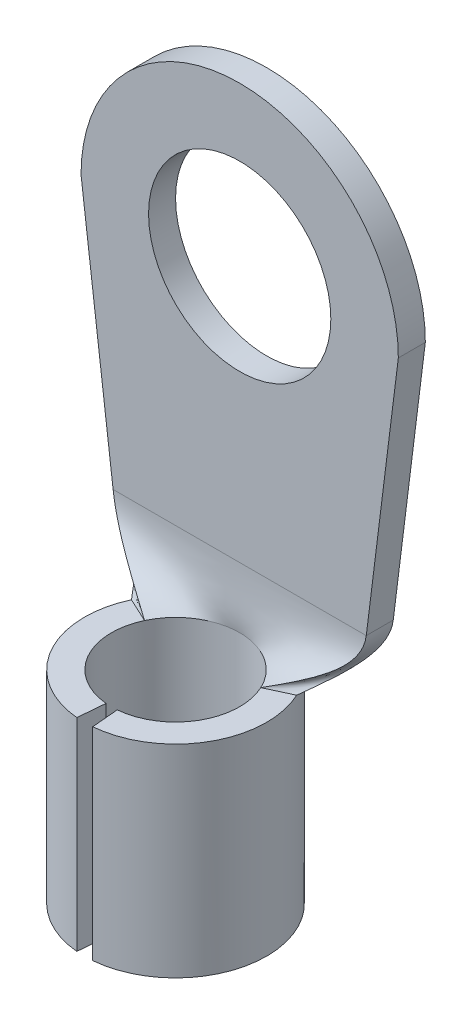
ISO-10303-21;
HEADER;
FILE_DESCRIPTION(('STEP AP214'),'2;1');
FILE_NAME('part.step','',(''),(''),'','','');
FILE_SCHEMA(('AUTOMOTIVE_DESIGN { 1 0 10303 214 1 1 1 1 }'));
ENDSEC;
DATA;
#1=APPLICATION_CONTEXT('core data for automotive mechanical design processes');
#2=APPLICATION_PROTOCOL_DEFINITION('international standard','automotive_design',2000,#1);
#3=PRODUCT_CONTEXT('',#1,'mechanical');
#4=PRODUCT('Part','Part','',(#3));
#5=PRODUCT_RELATED_PRODUCT_CATEGORY('part','',(#4));
#6=PRODUCT_DEFINITION_FORMATION('','',#4);
#7=PRODUCT_DEFINITION_CONTEXT('part definition',#1,'design');
#8=PRODUCT_DEFINITION('design','',#6,#7);
#9=PRODUCT_DEFINITION_SHAPE('','',#8);
#10=(LENGTH_UNIT() NAMED_UNIT(*) SI_UNIT(.MILLI.,.METRE.));
#11=(NAMED_UNIT(*) PLANE_ANGLE_UNIT() SI_UNIT($,.RADIAN.));
#12=(NAMED_UNIT(*) SI_UNIT($,.STERADIAN.) SOLID_ANGLE_UNIT());
#13=UNCERTAINTY_MEASURE_WITH_UNIT(LENGTH_MEASURE(1.E-05),#10,'distance_accuracy_value','');
#14=(GEOMETRIC_REPRESENTATION_CONTEXT(3) GLOBAL_UNCERTAINTY_ASSIGNED_CONTEXT((#13)) GLOBAL_UNIT_ASSIGNED_CONTEXT((#10,
#11,#12)) REPRESENTATION_CONTEXT('',''));
#15=CARTESIAN_POINT('',(0.,0.,0.));
#16=DIRECTION('',(0.,0.,1.));
#17=DIRECTION('',(1.,0.,0.));
#18=AXIS2_PLACEMENT_3D('',#15,#16,#17);
#19=CARTESIAN_POINT('',(5.87716923076923,-0.734646153846153,1.016));
#20=DIRECTION('',(-0.992277876713668,0.124034734589208,0.));
#21=DIRECTION('',(-0.124034734589208,-0.992277876713668,0.));
#22=AXIS2_PLACEMENT_3D('',#19,#20,#21);
#23=PLANE('',#22);
#24=DIRECTION('',(0.124034734589208,0.992277876713668,0.));
#25=VECTOR('',#24,1.);
#26=CARTESIAN_POINT('',(5.87716923076923,-0.734646153846153,0.));
#27=LINE('',#26,#25);
#28=CARTESIAN_POINT('',(4.7625,-9.652,0.));
#29=VERTEX_POINT('',#28);
#30=CARTESIAN_POINT('',(5.969,0.,0.));
#31=VERTEX_POINT('',#30);
#32=EDGE_CURVE('E262',#29,#31,#27,.T.);
#33=ORIENTED_EDGE('',*,*,#32,.T.);
#34=DIRECTION('',(0.,0.,-1.));
#35=VECTOR('',#34,1.);
#36=CARTESIAN_POINT('',(5.969,0.,1.016));
#37=LINE('',#36,#35);
#38=CARTESIAN_POINT('',(5.969,0.,1.016));
#39=VERTEX_POINT('',#38);
#40=EDGE_CURVE('E207',#39,#31,#37,.T.);
#41=ORIENTED_EDGE('',*,*,#40,.F.);
#42=DIRECTION('',(0.124034734589208,0.992277876713668,0.));
#43=VECTOR('',#42,1.);
#44=CARTESIAN_POINT('',(5.87716923076923,-0.734646153846153,1.016));
#45=LINE('',#44,#43);
#46=CARTESIAN_POINT('',(4.7625,-9.652,1.016));
#47=VERTEX_POINT('',#46);
#48=EDGE_CURVE('E295',#47,#39,#45,.T.);
#49=ORIENTED_EDGE('',*,*,#48,.F.);
#50=DIRECTION('',(0.,0.,-1.));
#51=VECTOR('',#50,1.);
#52=CARTESIAN_POINT('',(4.7625,-9.652,1.016));
#53=LINE('',#52,#51);
#54=EDGE_CURVE('E276',#47,#29,#53,.T.);
#55=ORIENTED_EDGE('',*,*,#54,.T.);
#56=EDGE_LOOP('',(#33,#41,#49,#55));
#57=FACE_BOUND('',#56,.T.);
#58=ADVANCED_FACE('F56',(#57),#23,.F.);
#59=CARTESIAN_POINT('',(0.,0.,1.016));
#60=DIRECTION('',(0.,0.,-1.));
#61=DIRECTION('',(-1.,0.,0.));
#62=AXIS2_PLACEMENT_3D('',#59,#60,#61);
#63=CYLINDRICAL_SURFACE('',#62,5.969);
#64=CARTESIAN_POINT('',(0.,0.,0.));
#65=DIRECTION('',(0.,0.,1.));
#66=DIRECTION('',(1.,0.,0.));
#67=AXIS2_PLACEMENT_3D('',#64,#65,#66);
#68=CIRCLE('',#67,5.969);
#69=CARTESIAN_POINT('',(-5.969,0.,0.));
#70=VERTEX_POINT('',#69);
#71=EDGE_CURVE('E285',#31,#70,#68,.T.);
#72=ORIENTED_EDGE('',*,*,#71,.T.);
#73=DIRECTION('',(0.,0.,-1.));
#74=VECTOR('',#73,1.);
#75=CARTESIAN_POINT('',(-5.969,0.,1.016));
#76=LINE('',#75,#74);
#77=CARTESIAN_POINT('',(-5.969,0.,1.016));
#78=VERTEX_POINT('',#77);
#79=EDGE_CURVE('E211',#78,#70,#76,.T.);
#80=ORIENTED_EDGE('',*,*,#79,.F.);
#81=CARTESIAN_POINT('',(0.,0.,1.016));
#82=DIRECTION('',(0.,0.,1.));
#83=DIRECTION('',(1.,0.,0.));
#84=AXIS2_PLACEMENT_3D('',#81,#82,#83);
#85=CIRCLE('',#84,5.969);
#86=EDGE_CURVE('E294',#39,#78,#85,.T.);
#87=ORIENTED_EDGE('',*,*,#86,.F.);
#88=ORIENTED_EDGE('',*,*,#40,.T.);
#89=EDGE_LOOP('',(#72,#80,#87,#88));
#90=FACE_BOUND('',#89,.T.);
#91=ADVANCED_FACE('F320',(#90),#63,.T.);
#92=CARTESIAN_POINT('',(-5.87716923076923,-0.734646153846154,1.016));
#93=DIRECTION('',(-0.992277876713668,-0.124034734589208,0.));
#94=DIRECTION('',(0.124034734589208,-0.992277876713668,0.));
#95=AXIS2_PLACEMENT_3D('',#92,#93,#94);
#96=PLANE('',#95);
#97=DIRECTION('',(-0.124034734589208,0.992277876713668,0.));
#98=VECTOR('',#97,1.);
#99=CARTESIAN_POINT('',(-5.87716923076923,-0.734646153846154,0.));
#100=LINE('',#99,#98);
#101=CARTESIAN_POINT('',(-4.7625,-9.652,0.));
#102=VERTEX_POINT('',#101);
#103=EDGE_CURVE('E282',#102,#70,#100,.T.);
#104=ORIENTED_EDGE('',*,*,#103,.F.);
#105=DIRECTION('',(0.,0.,-1.));
#106=VECTOR('',#105,1.);
#107=CARTESIAN_POINT('',(-4.7625,-9.652,1.016));
#108=LINE('',#107,#106);
#109=CARTESIAN_POINT('',(-4.7625,-9.652,1.016));
#110=VERTEX_POINT('',#109);
#111=EDGE_CURVE('E273',#110,#102,#108,.T.);
#112=ORIENTED_EDGE('',*,*,#111,.F.);
#113=DIRECTION('',(-0.124034734589208,0.992277876713668,0.));
#114=VECTOR('',#113,1.);
#115=CARTESIAN_POINT('',(-5.87716923076923,-0.734646153846154,1.016));
#116=LINE('',#115,#114);
#117=EDGE_CURVE('E291',#110,#78,#116,.T.);
#118=ORIENTED_EDGE('',*,*,#117,.T.);
#119=ORIENTED_EDGE('',*,*,#79,.T.);
#120=EDGE_LOOP('',(#104,#112,#118,#119));
#121=FACE_BOUND('',#120,.T.);
#122=ADVANCED_FACE('F317',(#121),#96,.T.);
#123=CARTESIAN_POINT('',(0.,0.,1.016));
#124=DIRECTION('',(0.,0.,-1.));
#125=DIRECTION('',(-1.,0.,0.));
#126=AXIS2_PLACEMENT_3D('',#123,#124,#125);
#127=CYLINDRICAL_SURFACE('',#126,3.429);
#128=CARTESIAN_POINT('',(0.,0.,1.016));
#129=DIRECTION('',(0.,0.,1.));
#130=DIRECTION('',(1.,0.,0.));
#131=AXIS2_PLACEMENT_3D('',#128,#129,#130);
#132=CIRCLE('',#131,3.429);
#133=CARTESIAN_POINT('',(3.429,0.,1.016));
#134=VERTEX_POINT('',#133);
#135=EDGE_CURVE('E245',#134,#134,#132,.T.);
#136=ORIENTED_EDGE('',*,*,#135,.T.);
#137=EDGE_LOOP('',(#136));
#138=FACE_BOUND('',#137,.T.);
#139=CARTESIAN_POINT('',(0.,0.,0.));
#140=DIRECTION('',(0.,0.,1.));
#141=DIRECTION('',(1.,0.,0.));
#142=AXIS2_PLACEMENT_3D('',#139,#140,#141);
#143=CIRCLE('',#142,3.429);
#144=CARTESIAN_POINT('',(3.429,0.,0.));
#145=VERTEX_POINT('',#144);
#146=EDGE_CURVE('E258',#145,#145,#143,.T.);
#147=ORIENTED_EDGE('',*,*,#146,.F.);
#148=EDGE_LOOP('',(#147));
#149=FACE_BOUND('',#148,.T.);
#150=ADVANCED_FACE('F303',(#138,#149),#127,.F.);
#151=CARTESIAN_POINT('',(0.,0.,1.016));
#152=DIRECTION('',(0.,0.,1.));
#153=DIRECTION('',(1.,0.,0.));
#154=AXIS2_PLACEMENT_3D('',#151,#152,#153);
#155=PLANE('',#154);
#156=ORIENTED_EDGE('',*,*,#135,.F.);
#157=EDGE_LOOP('',(#156));
#158=FACE_BOUND('',#157,.T.);
#159=ORIENTED_EDGE('',*,*,#48,.T.);
#160=ORIENTED_EDGE('',*,*,#86,.T.);
#161=ORIENTED_EDGE('',*,*,#117,.F.);
#162=DIRECTION('',(1.,0.,0.));
#163=VECTOR('',#162,1.);
#164=CARTESIAN_POINT('',(0.,-9.652,1.016));
#165=LINE('',#164,#163);
#166=EDGE_CURVE('E278',#110,#47,#165,.T.);
#167=ORIENTED_EDGE('',*,*,#166,.T.);
#168=EDGE_LOOP('',(#159,#160,#161,#167));
#169=FACE_BOUND('',#168,.T.);
#170=ADVANCED_FACE('F306',(#158,#169),#155,.T.);
#171=CARTESIAN_POINT('',(0.,0.,0.));
#172=DIRECTION('',(0.,0.,1.));
#173=DIRECTION('',(1.,0.,0.));
#174=AXIS2_PLACEMENT_3D('',#171,#172,#173);
#175=PLANE('',#174);
#176=ORIENTED_EDGE('',*,*,#146,.T.);
#177=EDGE_LOOP('',(#176));
#178=FACE_BOUND('',#177,.T.);
#179=ORIENTED_EDGE('',*,*,#32,.F.);
#180=DIRECTION('',(1.,0.,0.));
#181=VECTOR('',#180,1.);
#182=CARTESIAN_POINT('',(0.,-9.652,0.));
#183=LINE('',#182,#181);
#184=EDGE_CURVE('E279',#102,#29,#183,.T.);
#185=ORIENTED_EDGE('',*,*,#184,.F.);
#186=ORIENTED_EDGE('',*,*,#103,.T.);
#187=ORIENTED_EDGE('',*,*,#71,.F.);
#188=EDGE_LOOP('',(#179,#185,#186,#187));
#189=FACE_BOUND('',#188,.T.);
#190=ADVANCED_FACE('F308',(#178,#189),#175,.F.);
#191=CARTESIAN_POINT('',(4.7625,-9.652,0.));
#192=CARTESIAN_POINT('',(4.61997193408457,-10.7922245273234,0.));
#193=CARTESIAN_POINT('',(3.86385066791662,-11.3651122636617,0.989920990245575));
#194=CARTESIAN_POINT('',(3.10772940174868,-11.938,1.97984198049115));
#195=CARTESIAN_POINT('',(4.7625,-9.652,1.016));
#196=CARTESIAN_POINT('',(4.60890783998083,-10.8807372801533,1.016));
#197=CARTESIAN_POINT('',(3.39791426505014,-11.4093686400767,1.71261106720985));
#198=CARTESIAN_POINT('',(2.18692069011944,-11.938,2.4092221344197));
#199=B_SPLINE_SURFACE_WITH_KNOTS('',1,3,((#191,#192,#193,#194),(#195,#196,#197,#198)),
.UNSPECIFIED.,.F.,.F.,.F.,(2,2),(4,4),(0.,1.),(0.,1.),.UNSPECIFIED.);
#200=CARTESIAN_POINT('',(4.7625,-9.652,1.016));
#201=CARTESIAN_POINT('',(4.60890783998083,-10.8807372801533,1.016));
#202=CARTESIAN_POINT('',(3.39791426505014,-11.4093686400767,1.71261106720985));
#203=CARTESIAN_POINT('',(2.18692069011944,-11.938,2.4092221344197));
#204=B_SPLINE_CURVE_WITH_KNOTS('',3,(#200,#201,#202,#203),.UNSPECIFIED.,.F.,.F.,(4,4),(0.,1.),.UNSPECIFIED.);
#205=CARTESIAN_POINT('',(2.18692069011944,-11.938,2.4092221344197));
#206=VERTEX_POINT('',#205);
#207=EDGE_CURVE('E255',#47,#206,#204,.T.);
#208=DIRECTION('',(-0.906307787036651,0.,0.422618261740697));
#209=VECTOR('',#208,1.);
#210=CARTESIAN_POINT('',(2.18692069011944,-11.938,2.4092221344197));
#211=LINE('',#210,#209);
#212=CARTESIAN_POINT('',(3.10772940174868,-11.938,1.97984198049115));
#213=VERTEX_POINT('',#212);
#214=EDGE_CURVE('E200',#213,#206,#211,.T.);
#215=CARTESIAN_POINT('',(4.7625,-9.652,0.));
#216=CARTESIAN_POINT('',(4.61997193408457,-10.7922245273234,0.));
#217=CARTESIAN_POINT('',(3.86385066791662,-11.3651122636617,0.989920990245575));
#218=CARTESIAN_POINT('',(3.10772940174868,-11.938,1.97984198049115));
#219=B_SPLINE_CURVE_WITH_KNOTS('',3,(#215,#216,#217,#218),.UNSPECIFIED.,.F.,.F.,(4,4),(0.,1.),.UNSPECIFIED.);
#220=EDGE_CURVE('E223',#213,#29,#219,.F.);
#221=ORIENTED_EDGE('',*,*,#54,.F.);
#222=ORIENTED_EDGE('',*,*,#207,.T.);
#223=ORIENTED_EDGE('',*,*,#214,.F.);
#224=ORIENTED_EDGE('',*,*,#220,.T.);
#225=EDGE_LOOP('',(#221,#222,#223,#224));
#226=FACE_BOUND('',#225,.T.);
#227=ADVANCED_FACE('F314',(#226),#199,.T.);
#228=CARTESIAN_POINT('',(4.7625,-9.652,1.016));
#229=CARTESIAN_POINT('',(4.60890783998083,-10.8807372801533,1.016));
#230=CARTESIAN_POINT('',(3.39791426505014,-11.4093686400767,1.71261106720985));
#231=CARTESIAN_POINT('',(2.18692069011944,-11.938,2.4092221344197));
#232=CARTESIAN_POINT('',(1.5875,-9.652,1.016));
#233=CARTESIAN_POINT('',(1.53630261332695,-10.8807372801533,1.016));
#234=CARTESIAN_POINT('',(1.47060725154774,-11.0785469924376,0.874735506767064));
#235=CARTESIAN_POINT('',(1.18517093190492,-11.938,0.26096284530987));
#236=CARTESIAN_POINT('',(-1.5875,-9.652,1.016));
#237=CARTESIAN_POINT('',(-1.53630261332694,-10.8807372801533,1.016));
#238=CARTESIAN_POINT('',(-1.47060725154773,-11.0785469924376,0.874735506767064));
#239=CARTESIAN_POINT('',(-1.18517093190492,-11.938,0.260962845309871));
#240=CARTESIAN_POINT('',(-4.7625,-9.652,1.016));
#241=CARTESIAN_POINT('',(-4.60890783998083,-10.8807372801533,1.016));
#242=CARTESIAN_POINT('',(-3.39791426505013,-11.4093686400767,1.71261106720985));
#243=CARTESIAN_POINT('',(-2.18692069011944,-11.938,2.4092221344197));
#244=(BOUNDED_SURFACE() B_SPLINE_SURFACE(3,3,((#228,#229,#230,#231),(#232,#233,#234,#235),(#236,
#237,#238,#239),(#240,#241,#242,#243)),.UNSPECIFIED.,.F.,.F.,
.F.) B_SPLINE_SURFACE_WITH_KNOTS((4,4),(4,4),(0.,1.),(0.,1.),
.UNSPECIFIED.) GEOMETRIC_REPRESENTATION_ITEM() RATIONAL_B_SPLINE_SURFACE(((1.,1.,1.,1.),(1.,1.,
0.615078841160465,0.615078841160465),(1.,1.,0.615078841160465,0.615078841160465),(1.,1.,1.,1.))) REPRESENTATION_ITEM('') SURFACE());
#245=CARTESIAN_POINT('',(-4.7625,-9.652,1.016));
#246=CARTESIAN_POINT('',(-4.60890783998083,-10.8807372801533,1.016));
#247=CARTESIAN_POINT('',(-3.39791426505013,-11.4093686400767,1.71261106720985));
#248=CARTESIAN_POINT('',(-2.18692069011944,-11.938,2.4092221344197));
#249=B_SPLINE_CURVE_WITH_KNOTS('',3,(#245,#246,#247,#248),.UNSPECIFIED.,.F.,.F.,(4,4),(0.,1.),.UNSPECIFIED.);
#250=CARTESIAN_POINT('',(-2.18692069011944,-11.938,2.4092221344197));
#251=VERTEX_POINT('',#250);
#252=EDGE_CURVE('E218',#110,#251,#249,.T.);
#253=CARTESIAN_POINT('',(0.,-11.938,3.429));
#254=DIRECTION('',(0.,1.,0.));
#255=DIRECTION('',(1.,0.,0.));
#256=AXIS2_PLACEMENT_3D('',#253,#254,#255);
#257=CIRCLE('',#256,2.413);
#258=EDGE_CURVE('E177',#206,#251,#257,.T.);
#259=ORIENTED_EDGE('',*,*,#166,.F.);
#260=ORIENTED_EDGE('',*,*,#252,.T.);
#261=ORIENTED_EDGE('',*,*,#258,.F.);
#262=ORIENTED_EDGE('',*,*,#207,.F.);
#263=EDGE_LOOP('',(#259,#260,#261,#262));
#264=FACE_BOUND('',#263,.T.);
#265=ADVANCED_FACE('F367',(#264),#244,.T.);
#266=CARTESIAN_POINT('',(-4.7625,-9.652,0.));
#267=CARTESIAN_POINT('',(-4.61997193408457,-10.7922245273234,0.));
#268=CARTESIAN_POINT('',(-3.86385066791662,-11.3651122636617,0.989920990245576));
#269=CARTESIAN_POINT('',(-3.10772940174868,-11.938,1.97984198049115));
#270=CARTESIAN_POINT('',(-1.5875,-9.652,0.));
#271=CARTESIAN_POINT('',(-1.53999064469486,-10.7922245273234,0.));
#272=CARTESIAN_POINT('',(-1.56696982989161,-11.0065946288489,-0.20074427985733));
#273=CARTESIAN_POINT('',(-1.68419027165436,-11.938,-1.07294753561229));
#274=CARTESIAN_POINT('',(1.5875,-9.652,0.));
#275=CARTESIAN_POINT('',(1.53999064469486,-10.7922245273234,0.));
#276=CARTESIAN_POINT('',(1.56696982989161,-11.0065946288489,-0.20074427985733));
#277=CARTESIAN_POINT('',(1.68419027165436,-11.938,-1.07294753561229));
#278=CARTESIAN_POINT('',(4.7625,-9.652,0.));
#279=CARTESIAN_POINT('',(4.61997193408457,-10.7922245273234,0.));
#280=CARTESIAN_POINT('',(3.86385066791662,-11.3651122636617,0.989920990245574));
#281=CARTESIAN_POINT('',(3.10772940174868,-11.938,1.97984198049115));
#282=(BOUNDED_SURFACE() B_SPLINE_SURFACE(3,3,((#266,#267,#268,#269),(#270,#271,#272,#273),(#274,
#275,#276,#277),(#278,#279,#280,#281)),.UNSPECIFIED.,.F.,.F.,
.F.) B_SPLINE_SURFACE_WITH_KNOTS((4,4),(4,4),(0.,1.),(0.,1.),
.UNSPECIFIED.) GEOMETRIC_REPRESENTATION_ITEM() RATIONAL_B_SPLINE_SURFACE(((1.,1.,1.,1.),(1.,1.,
0.615078841160465,0.615078841160465),(1.,1.,0.615078841160465,0.615078841160465),(1.,1.,1.,1.))) REPRESENTATION_ITEM('') SURFACE());
#283=CARTESIAN_POINT('',(0.,-11.938,3.429));
#284=DIRECTION('',(0.,-1.,0.));
#285=DIRECTION('',(1.,0.,0.));
#286=AXIS2_PLACEMENT_3D('',#283,#284,#285);
#287=CIRCLE('',#286,3.429);
#288=CARTESIAN_POINT('',(-3.10772940174867,-11.938,1.97984198049115));
#289=VERTEX_POINT('',#288);
#290=EDGE_CURVE('E191',#289,#213,#287,.T.);
#291=CARTESIAN_POINT('',(-4.7625,-9.652,0.));
#292=CARTESIAN_POINT('',(-4.61997193408457,-10.7922245273234,0.));
#293=CARTESIAN_POINT('',(-3.86385066791662,-11.3651122636617,0.989920990245576));
#294=CARTESIAN_POINT('',(-3.10772940174868,-11.938,1.97984198049115));
#295=B_SPLINE_CURVE_WITH_KNOTS('',3,(#291,#292,#293,#294),.UNSPECIFIED.,.F.,.F.,(4,4),(0.,1.),.UNSPECIFIED.);
#296=EDGE_CURVE('E224',#289,#102,#295,.F.);
#297=ORIENTED_EDGE('',*,*,#184,.T.);
#298=ORIENTED_EDGE('',*,*,#220,.F.);
#299=ORIENTED_EDGE('',*,*,#290,.F.);
#300=ORIENTED_EDGE('',*,*,#296,.T.);
#301=EDGE_LOOP('',(#297,#298,#299,#300));
#302=FACE_BOUND('',#301,.T.);
#303=ADVANCED_FACE('F343',(#302),#282,.T.);
#304=CARTESIAN_POINT('',(-4.7625,-9.652,1.016));
#305=CARTESIAN_POINT('',(-4.60890783998083,-10.8807372801533,1.016));
#306=CARTESIAN_POINT('',(-3.39791426505013,-11.4093686400767,1.71261106720985));
#307=CARTESIAN_POINT('',(-2.18692069011944,-11.938,2.4092221344197));
#308=CARTESIAN_POINT('',(-4.7625,-9.652,0.));
#309=CARTESIAN_POINT('',(-4.61997193408457,-10.7922245273234,0.));
#310=CARTESIAN_POINT('',(-3.86385066791662,-11.3651122636617,0.989920990245575));
#311=CARTESIAN_POINT('',(-3.10772940174867,-11.938,1.97984198049115));
#312=B_SPLINE_SURFACE_WITH_KNOTS('',1,3,((#304,#305,#306,#307),(#308,#309,#310,#311)),
.UNSPECIFIED.,.F.,.F.,.F.,(2,2),(4,4),(0.,1.),(0.,1.),.UNSPECIFIED.);
#313=DIRECTION('',(-0.906307787036651,0.,-0.422618261740698));
#314=VECTOR('',#313,1.);
#315=CARTESIAN_POINT('',(-2.18692069011944,-11.938,2.4092221344197));
#316=LINE('',#315,#314);
#317=EDGE_CURVE('E234',#251,#289,#316,.T.);
#318=ORIENTED_EDGE('',*,*,#111,.T.);
#319=ORIENTED_EDGE('',*,*,#296,.F.);
#320=ORIENTED_EDGE('',*,*,#317,.F.);
#321=ORIENTED_EDGE('',*,*,#252,.F.);
#322=EDGE_LOOP('',(#318,#319,#320,#321));
#323=FACE_BOUND('',#322,.T.);
#324=ADVANCED_FACE('F341',(#323),#312,.T.);
#325=CARTESIAN_POINT('',(0.,-11.938,3.429));
#326=DIRECTION('',(0.,-1.,0.));
#327=DIRECTION('',(1.,0.,0.));
#328=AXIS2_PLACEMENT_3D('',#325,#326,#327);
#329=PLANE('',#328);
#330=CARTESIAN_POINT('',(0.,-11.938,3.429));
#331=DIRECTION('',(0.,1.,0.));
#332=DIRECTION('',(1.,0.,0.));
#333=AXIS2_PLACEMENT_3D('',#330,#331,#332);
#334=CIRCLE('',#333,2.413);
#335=CARTESIAN_POINT('',(-0.2103068072501,-11.938,5.83281780649538));
#336=VERTEX_POINT('',#335);
#337=EDGE_CURVE('E171',#251,#336,#334,.T.);
#338=ORIENTED_EDGE('',*,*,#337,.F.);
#339=ORIENTED_EDGE('',*,*,#317,.T.);
#340=CARTESIAN_POINT('',(0.,-11.938,3.429));
#341=DIRECTION('',(0.,-1.,0.));
#342=DIRECTION('',(1.,0.,0.));
#343=AXIS2_PLACEMENT_3D('',#340,#341,#342);
#344=CIRCLE('',#343,3.429);
#345=CARTESIAN_POINT('',(-0.298857041881718,-11.938,6.8449516197566));
#346=VERTEX_POINT('',#345);
#347=EDGE_CURVE('E182',#346,#289,#344,.T.);
#348=ORIENTED_EDGE('',*,*,#347,.F.);
#349=DIRECTION('',(-0.087155742747655,0.,0.996194698091746));
#350=VECTOR('',#349,1.);
#351=CARTESIAN_POINT('',(-0.2103068072501,-11.938,5.83281780649538));
#352=LINE('',#351,#350);
#353=EDGE_CURVE('E151',#336,#346,#352,.T.);
#354=ORIENTED_EDGE('',*,*,#353,.F.);
#355=EDGE_LOOP('',(#338,#339,#348,#354));
#356=FACE_BOUND('',#355,.T.);
#357=ADVANCED_FACE('F346',(#356),#329,.F.);
#358=CARTESIAN_POINT('',(0.298857041881722,-11.938,6.8449516197566));
#359=VERTEX_POINT('',#358);
#360=EDGE_CURVE('E186',#213,#359,#344,.T.);
#361=ORIENTED_EDGE('',*,*,#360,.F.);
#362=ORIENTED_EDGE('',*,*,#214,.T.);
#363=CARTESIAN_POINT('',(0.210306807250101,-11.938,5.83281780649538));
#364=VERTEX_POINT('',#363);
#365=EDGE_CURVE('E174',#364,#206,#334,.T.);
#366=ORIENTED_EDGE('',*,*,#365,.F.);
#367=DIRECTION('',(-0.0871557427476584,0.,-0.996194698091746));
#368=VECTOR('',#367,1.);
#369=CARTESIAN_POINT('',(0.210306807250101,-11.938,5.83281780649538));
#370=LINE('',#369,#368);
#371=EDGE_CURVE('E145',#359,#364,#370,.T.);
#372=ORIENTED_EDGE('',*,*,#371,.F.);
#373=EDGE_LOOP('',(#361,#362,#366,#372));
#374=FACE_BOUND('',#373,.T.);
#375=ADVANCED_FACE('F198',(#374),#329,.F.);
#376=CARTESIAN_POINT('',(0.,-19.558,3.429));
#377=DIRECTION('',(0.,1.,0.));
#378=DIRECTION('',(-1.,0.,0.));
#379=AXIS2_PLACEMENT_3D('',#376,#377,#378);
#380=CYLINDRICAL_SURFACE('',#379,2.413);
#381=DIRECTION('',(0.,1.,0.));
#382=VECTOR('',#381,1.);
#383=CARTESIAN_POINT('',(-0.210306807250098,-19.558,5.83281780649538));
#384=LINE('',#383,#382);
#385=CARTESIAN_POINT('',(-0.210306807250098,-19.304,5.83281780649538));
#386=VERTEX_POINT('',#385);
#387=EDGE_CURVE('E155',#386,#336,#384,.T.);
#388=ORIENTED_EDGE('',*,*,#387,.F.);
#389=CARTESIAN_POINT('',(0.,-19.304,3.429));
#390=DIRECTION('',(0.,-1.,0.));
#391=DIRECTION('',(1.,0.,0.));
#392=AXIS2_PLACEMENT_3D('',#389,#390,#391);
#393=CIRCLE('',#392,2.413);
#394=CARTESIAN_POINT('',(0.210306807250102,-19.304,5.83281780649538));
#395=VERTEX_POINT('',#394);
#396=EDGE_CURVE('E64',#386,#395,#393,.T.);
#397=ORIENTED_EDGE('',*,*,#396,.T.);
#398=DIRECTION('',(0.,1.,0.));
#399=VECTOR('',#398,1.);
#400=CARTESIAN_POINT('',(0.210306807250102,-19.558,5.83281780649538));
#401=LINE('',#400,#399);
#402=EDGE_CURVE('E163',#395,#364,#401,.T.);
#403=ORIENTED_EDGE('',*,*,#402,.T.);
#404=ORIENTED_EDGE('',*,*,#365,.T.);
#405=ORIENTED_EDGE('',*,*,#258,.T.);
#406=ORIENTED_EDGE('',*,*,#337,.T.);
#407=EDGE_LOOP('',(#388,#397,#403,#404,#405,#406));
#408=FACE_BOUND('',#407,.T.);
#409=ADVANCED_FACE('F202',(#408),#380,.F.);
#410=CARTESIAN_POINT('',(-0.210306807250098,-19.558,5.83281780649538));
#411=DIRECTION('',(-0.996194698091746,0.,-0.087155742747655));
#412=DIRECTION('',(-0.0871557427476551,0.,0.996194698091746));
#413=AXIS2_PLACEMENT_3D('',#410,#411,#412);
#414=PLANE('',#413);
#415=DIRECTION('',(-0.087155742747655,0.,0.996194698091746));
#416=VECTOR('',#415,1.);
#417=CARTESIAN_POINT('',(-0.210306807250098,-19.558,5.83281780649538));
#418=LINE('',#417,#416);
#419=CARTESIAN_POINT('',(-0.232444365908003,-19.558,6.08585125981069));
#420=VERTEX_POINT('',#419);
#421=CARTESIAN_POINT('',(-0.298857041881716,-19.558,6.8449516197566));
#422=VERTEX_POINT('',#421);
#423=EDGE_CURVE('E136',#420,#422,#418,.T.);
#424=ORIENTED_EDGE('',*,*,#423,.F.);
#425=CARTESIAN_POINT('',(-0.232444365907992,-19.304,6.08585125981069));
#426=DIRECTION('',(-0.996194698091746,0.,-0.087155742747655));
#427=DIRECTION('',(-0.0871557427476551,0.,0.996194698091746));
#428=AXIS2_PLACEMENT_3D('',#425,#426,#427);
#429=CIRCLE('',#428,0.254);
#430=EDGE_CURVE('E78',#420,#386,#429,.F.);
#431=ORIENTED_EDGE('',*,*,#430,.T.);
#432=ORIENTED_EDGE('',*,*,#387,.T.);
#433=ORIENTED_EDGE('',*,*,#353,.T.);
#434=DIRECTION('',(0.,1.,0.));
#435=VECTOR('',#434,1.);
#436=CARTESIAN_POINT('',(-0.298857041881716,-19.558,6.8449516197566));
#437=LINE('',#436,#435);
#438=EDGE_CURVE('E148',#422,#346,#437,.T.);
#439=ORIENTED_EDGE('',*,*,#438,.F.);
#440=EDGE_LOOP('',(#424,#431,#432,#433,#439));
#441=FACE_BOUND('',#440,.T.);
#442=ADVANCED_FACE('F149',(#441),#414,.F.);
#443=CARTESIAN_POINT('',(0.,-19.558,3.429));
#444=DIRECTION('',(0.,1.,0.));
#445=DIRECTION('',(-1.,0.,0.));
#446=AXIS2_PLACEMENT_3D('',#443,#444,#445);
#447=CYLINDRICAL_SURFACE('',#446,3.429);
#448=ORIENTED_EDGE('',*,*,#347,.T.);
#449=ORIENTED_EDGE('',*,*,#290,.T.);
#450=ORIENTED_EDGE('',*,*,#360,.T.);
#451=DIRECTION('',(0.,1.,0.));
#452=VECTOR('',#451,1.);
#453=CARTESIAN_POINT('',(0.298857041881723,-19.558,6.8449516197566));
#454=LINE('',#453,#452);
#455=CARTESIAN_POINT('',(0.298857041881723,-19.558,6.8449516197566));
#456=VERTEX_POINT('',#455);
#457=EDGE_CURVE('E156',#456,#359,#454,.T.);
#458=ORIENTED_EDGE('',*,*,#457,.F.);
#459=CARTESIAN_POINT('',(0.,-19.558,3.429));
#460=DIRECTION('',(0.,-1.,0.));
#461=DIRECTION('',(1.,0.,0.));
#462=AXIS2_PLACEMENT_3D('',#459,#460,#461);
#463=CIRCLE('',#462,3.429);
#464=EDGE_CURVE('E141',#422,#456,#463,.T.);
#465=ORIENTED_EDGE('',*,*,#464,.F.);
#466=ORIENTED_EDGE('',*,*,#438,.T.);
#467=EDGE_LOOP('',(#448,#449,#450,#458,#465,#466));
#468=FACE_BOUND('',#467,.T.);
#469=ADVANCED_FACE('F158',(#468),#447,.T.);
#470=CARTESIAN_POINT('',(0.210306807250102,-19.558,5.83281780649538));
#471=DIRECTION('',(0.996194698091745,0.,-0.0871557427476584));
#472=DIRECTION('',(-0.0871557427476585,0.,-0.996194698091746));
#473=AXIS2_PLACEMENT_3D('',#470,#471,#472);
#474=PLANE('',#473);
#475=ORIENTED_EDGE('',*,*,#402,.F.);
#476=CARTESIAN_POINT('',(0.232444365908009,-19.304,6.08585125981069));
#477=DIRECTION('',(0.996194698091745,0.,-0.0871557427476584));
#478=DIRECTION('',(-0.0871557427476585,0.,-0.996194698091746));
#479=AXIS2_PLACEMENT_3D('',#476,#477,#478);
#480=CIRCLE('',#479,0.254);
#481=CARTESIAN_POINT('',(0.232444365908008,-19.558,6.08585125981069));
#482=VERTEX_POINT('',#481);
#483=EDGE_CURVE('E12',#395,#482,#480,.F.);
#484=ORIENTED_EDGE('',*,*,#483,.T.);
#485=DIRECTION('',(-0.0871557427476584,0.,-0.996194698091746));
#486=VECTOR('',#485,1.);
#487=CARTESIAN_POINT('',(0.210306807250102,-19.558,5.83281780649538));
#488=LINE('',#487,#486);
#489=EDGE_CURVE('E161',#456,#482,#488,.T.);
#490=ORIENTED_EDGE('',*,*,#489,.F.);
#491=ORIENTED_EDGE('',*,*,#457,.T.);
#492=ORIENTED_EDGE('',*,*,#371,.T.);
#493=EDGE_LOOP('',(#475,#484,#490,#491,#492));
#494=FACE_BOUND('',#493,.T.);
#495=ADVANCED_FACE('F196',(#494),#474,.F.);
#496=CARTESIAN_POINT('',(0.,-19.558,3.429));
#497=DIRECTION('',(0.,-1.,0.));
#498=DIRECTION('',(1.,0.,0.));
#499=AXIS2_PLACEMENT_3D('',#496,#497,#498);
#500=PLANE('',#499);
#501=ORIENTED_EDGE('',*,*,#489,.T.);
#502=CARTESIAN_POINT('',(0.,-19.558,3.429));
#503=DIRECTION('',(0.,-1.,0.));
#504=DIRECTION('',(1.,0.,0.));
#505=AXIS2_PLACEMENT_3D('',#502,#503,#504);
#506=CIRCLE('',#505,2.667);
#507=EDGE_CURVE('E144',#482,#420,#506,.F.);
#508=ORIENTED_EDGE('',*,*,#507,.T.);
#509=ORIENTED_EDGE('',*,*,#423,.T.);
#510=ORIENTED_EDGE('',*,*,#464,.T.);
#511=EDGE_LOOP('',(#501,#508,#509,#510));
#512=FACE_BOUND('',#511,.T.);
#513=ADVANCED_FACE('F139',(#512),#500,.T.);
#514=CARTESIAN_POINT('',(0.,-19.304,3.429));
#515=DIRECTION('',(0.,-1.,0.));
#516=DIRECTION('',(1.,0.,0.));
#517=AXIS2_PLACEMENT_3D('',#514,#515,#516);
#518=TOROIDAL_SURFACE('',#517,2.667,0.254);
#519=ORIENTED_EDGE('',*,*,#483,.F.);
#520=ORIENTED_EDGE('',*,*,#396,.F.);
#521=ORIENTED_EDGE('',*,*,#430,.F.);
#522=ORIENTED_EDGE('',*,*,#507,.F.);
#523=EDGE_LOOP('',(#519,#520,#521,#522));
#524=FACE_BOUND('',#523,.T.);
#525=ADVANCED_FACE('F58',(#524),#518,.T.);
#526=CLOSED_SHELL('',(#58,#91,#122,#150,#170,#190,#227,#265,#303,#324,#357,#375,#409,#442,#469,
#495,#513,#525));
#527=MANIFOLD_SOLID_BREP('B2',#526);
#528=ADVANCED_BREP_SHAPE_REPRESENTATION('',(#18,#527),#14);
#529=SHAPE_DEFINITION_REPRESENTATION(#9,#528);
ENDSEC;
END-ISO-10303-21;
